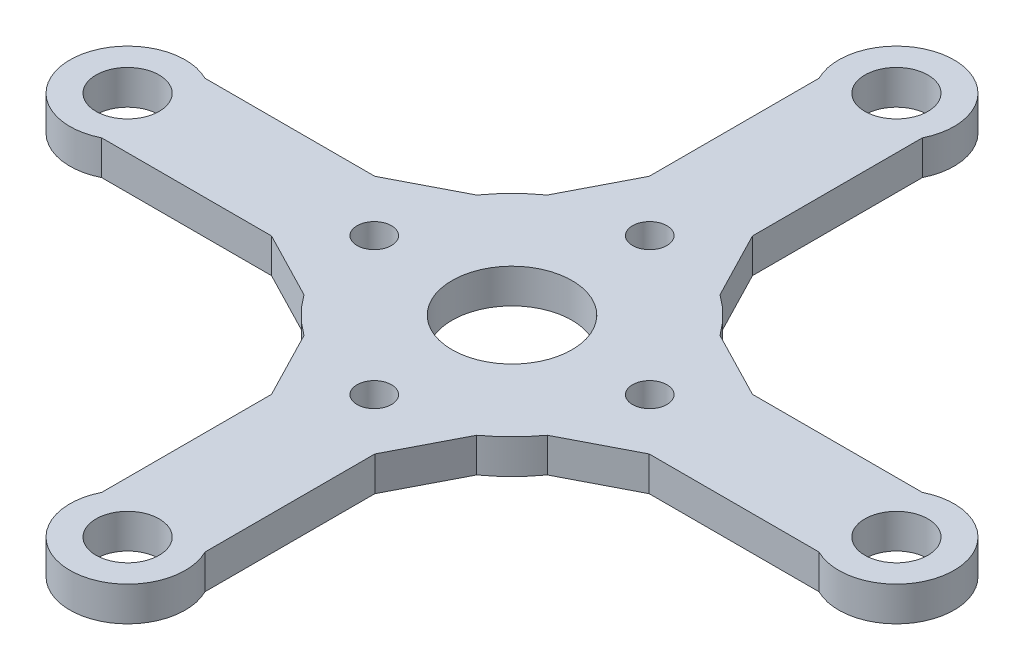
ISO-10303-21;
HEADER;
FILE_DESCRIPTION(('STEP AP214'),'2;1');
FILE_NAME('part.step','',(''),(''),'','','');
FILE_SCHEMA(('AUTOMOTIVE_DESIGN { 1 0 10303 214 1 1 1 1 }'));
ENDSEC;
DATA;
#1=APPLICATION_CONTEXT('core data for automotive mechanical design processes');
#2=APPLICATION_PROTOCOL_DEFINITION('international standard','automotive_design',2000,#1);
#3=PRODUCT_CONTEXT('',#1,'mechanical');
#4=PRODUCT('Part','Part','',(#3));
#5=PRODUCT_RELATED_PRODUCT_CATEGORY('part','',(#4));
#6=PRODUCT_DEFINITION_FORMATION('','',#4);
#7=PRODUCT_DEFINITION_CONTEXT('part definition',#1,'design');
#8=PRODUCT_DEFINITION('design','',#6,#7);
#9=PRODUCT_DEFINITION_SHAPE('','',#8);
#10=(LENGTH_UNIT() NAMED_UNIT(*) SI_UNIT(.MILLI.,.METRE.));
#11=(NAMED_UNIT(*) PLANE_ANGLE_UNIT() SI_UNIT($,.RADIAN.));
#12=(NAMED_UNIT(*) SI_UNIT($,.STERADIAN.) SOLID_ANGLE_UNIT());
#13=UNCERTAINTY_MEASURE_WITH_UNIT(LENGTH_MEASURE(1.E-05),#10,'distance_accuracy_value','');
#14=(GEOMETRIC_REPRESENTATION_CONTEXT(3) GLOBAL_UNCERTAINTY_ASSIGNED_CONTEXT((#13)) GLOBAL_UNIT_ASSIGNED_CONTEXT((#10,
#11,#12)) REPRESENTATION_CONTEXT('',''));
#15=CARTESIAN_POINT('',(0.,0.,0.));
#16=DIRECTION('',(0.,0.,1.));
#17=DIRECTION('',(1.,0.,0.));
#18=AXIS2_PLACEMENT_3D('',#15,#16,#17);
#19=CARTESIAN_POINT('',(-33.4949243756649,3.,4.09499580809621E-11));
#20=DIRECTION('',(0.,1.,0.));
#21=DIRECTION('',(0.,0.,1.));
#22=AXIS2_PLACEMENT_3D('',#19,#20,#21);
#23=PLANE('',#22);
#24=CARTESIAN_POINT('',(-1.03178333980677E-07,3.,-12.));
#25=DIRECTION('',(0.,1.,0.));
#26=DIRECTION('',(0.,0.,1.));
#27=AXIS2_PLACEMENT_3D('',#24,#25,#26);
#28=CIRCLE('',#27,1.5);
#29=CARTESIAN_POINT('',(-1.03178333980677E-07,3.,-10.5));
#30=VERTEX_POINT('',#29);
#31=EDGE_CURVE('E866',#30,#30,#28,.T.);
#32=ORIENTED_EDGE('',*,*,#31,.F.);
#33=EDGE_LOOP('',(#32));
#34=FACE_BOUND('',#33,.T.);
#35=CARTESIAN_POINT('',(12.,3.,-1.03178292082901E-07));
#36=DIRECTION('',(0.,1.,0.));
#37=DIRECTION('',(0.,0.,1.));
#38=AXIS2_PLACEMENT_3D('',#35,#36,#37);
#39=CIRCLE('',#38,1.5);
#40=CARTESIAN_POINT('',(12.,3.,1.49999989682171));
#41=VERTEX_POINT('',#40);
#42=EDGE_CURVE('E867',#41,#41,#39,.T.);
#43=ORIENTED_EDGE('',*,*,#42,.F.);
#44=EDGE_LOOP('',(#43));
#45=FACE_BOUND('',#44,.T.);
#46=CARTESIAN_POINT('',(1.03178250185125E-07,3.,12.));
#47=DIRECTION('',(0.,1.,0.));
#48=DIRECTION('',(0.,0.,1.));
#49=AXIS2_PLACEMENT_3D('',#46,#47,#48);
#50=CIRCLE('',#49,1.5);
#51=CARTESIAN_POINT('',(1.03178250185125E-07,3.,13.5));
#52=VERTEX_POINT('',#51);
#53=EDGE_CURVE('E871',#52,#52,#50,.T.);
#54=ORIENTED_EDGE('',*,*,#53,.F.);
#55=EDGE_LOOP('',(#54));
#56=FACE_BOUND('',#55,.T.);
#57=CARTESIAN_POINT('',(-12.,3.,1.03178208287349E-07));
#58=DIRECTION('',(0.,1.,0.));
#59=DIRECTION('',(0.,0.,1.));
#60=AXIS2_PLACEMENT_3D('',#57,#58,#59);
#61=CIRCLE('',#60,1.5);
#62=CARTESIAN_POINT('',(-12.,3.,1.50000010317821));
#63=VERTEX_POINT('',#62);
#64=EDGE_CURVE('E874',#63,#63,#61,.T.);
#65=ORIENTED_EDGE('',*,*,#64,.F.);
#66=EDGE_LOOP('',(#65));
#67=FACE_BOUND('',#66,.T.);
#68=CARTESIAN_POINT('',(0.,3.,0.));
#69=DIRECTION('',(0.,1.,0.));
#70=DIRECTION('',(0.,0.,1.));
#71=AXIS2_PLACEMENT_3D('',#68,#69,#70);
#72=CIRCLE('',#71,5.22630129733958);
#73=CARTESIAN_POINT('',(0.,3.,5.22630129733958));
#74=VERTEX_POINT('',#73);
#75=EDGE_CURVE('E303',#74,#74,#72,.T.);
#76=ORIENTED_EDGE('',*,*,#75,.F.);
#77=EDGE_LOOP('',(#76));
#78=FACE_BOUND('',#77,.T.);
#79=CARTESIAN_POINT('',(-4.09438051631735E-11,3.,-33.4949243756649));
#80=DIRECTION('',(0.,1.,0.));
#81=DIRECTION('',(0.,0.,1.));
#82=AXIS2_PLACEMENT_3D('',#79,#80,#81);
#83=CIRCLE('',#82,2.75);
#84=CARTESIAN_POINT('',(-4.09438051631735E-11,3.,-30.7449243756649));
#85=VERTEX_POINT('',#84);
#86=EDGE_CURVE('E326',#85,#85,#83,.T.);
#87=ORIENTED_EDGE('',*,*,#86,.F.);
#88=EDGE_LOOP('',(#87));
#89=FACE_BOUND('',#88,.T.);
#90=CARTESIAN_POINT('',(4.09561109987507E-11,3.,33.4949243756649));
#91=DIRECTION('',(0.,1.,0.));
#92=DIRECTION('',(0.,0.,1.));
#93=AXIS2_PLACEMENT_3D('',#90,#91,#92);
#94=CIRCLE('',#93,2.75);
#95=CARTESIAN_POINT('',(4.09561109987507E-11,3.,36.2449243756649));
#96=VERTEX_POINT('',#95);
#97=EDGE_CURVE('E338',#96,#96,#94,.T.);
#98=ORIENTED_EDGE('',*,*,#97,.F.);
#99=EDGE_LOOP('',(#98));
#100=FACE_BOUND('',#99,.T.);
#101=CARTESIAN_POINT('',(-33.4949243756649,3.,4.09499580809621E-11));
#102=DIRECTION('',(0.,1.,0.));
#103=DIRECTION('',(0.,0.,1.));
#104=AXIS2_PLACEMENT_3D('',#101,#102,#103);
#105=CIRCLE('',#104,5.02814778774127);
#106=CARTESIAN_POINT('',(-31.2516521731374,3.,-4.5000000000407));
#107=VERTEX_POINT('',#106);
#108=CARTESIAN_POINT('',(-31.2516521729731,3.,4.5000000000407));
#109=VERTEX_POINT('',#108);
#110=EDGE_CURVE('E210',#107,#109,#105,.T.);
#111=ORIENTED_EDGE('',*,*,#110,.T.);
#112=DIRECTION('',(1.,0.,0.));
#113=VECTOR('',#112,1.);
#114=CARTESIAN_POINT('',(-31.2516521729731,3.,4.5000000000407));
#115=LINE('',#114,#113);
#116=CARTESIAN_POINT('',(-16.4533616375495,3.,4.5000000000409));
#117=VERTEX_POINT('',#116);
#118=EDGE_CURVE('E201',#109,#117,#115,.T.);
#119=ORIENTED_EDGE('',*,*,#118,.T.);
#120=DIRECTION('',(0.888445801917198,0.,0.458981543262588));
#121=VECTOR('',#120,1.);
#122=CARTESIAN_POINT('',(-10.6022858569971,3.,7.52273451655177));
#123=LINE('',#122,#121);
#124=CARTESIAN_POINT('',(-10.6022858569971,3.,7.52273451655177));
#125=VERTEX_POINT('',#124);
#126=EDGE_CURVE('E11',#117,#125,#123,.T.);
#127=ORIENTED_EDGE('',*,*,#126,.T.);
#128=CARTESIAN_POINT('',(0.,3.,0.));
#129=DIRECTION('',(0.,1.,0.));
#130=DIRECTION('',(0.,0.,1.));
#131=AXIS2_PLACEMENT_3D('',#128,#129,#130);
#132=CIRCLE('',#131,13.);
#133=CARTESIAN_POINT('',(-7.52273451655174,3.,10.6022858569971));
#134=VERTEX_POINT('',#133);
#135=EDGE_CURVE('E209',#125,#134,#132,.T.);
#136=ORIENTED_EDGE('',*,*,#135,.T.);
#137=DIRECTION('',(0.4589815432626,0.,0.888445801917192));
#138=VECTOR('',#137,1.);
#139=CARTESIAN_POINT('',(-4.50000000004078,3.,16.4533616375495));
#140=LINE('',#139,#138);
#141=CARTESIAN_POINT('',(-4.50000000004079,3.,16.4533616375495));
#142=VERTEX_POINT('',#141);
#143=EDGE_CURVE('E296',#134,#142,#140,.T.);
#144=ORIENTED_EDGE('',*,*,#143,.T.);
#145=DIRECTION('',(0.,0.,1.));
#146=VECTOR('',#145,1.);
#147=CARTESIAN_POINT('',(-4.50000000004022,3.,31.2516521731369));
#148=LINE('',#147,#146);
#149=CARTESIAN_POINT('',(-4.5000000000402,3.,31.2516521731369));
#150=VERTEX_POINT('',#149);
#151=EDGE_CURVE('E345',#142,#150,#148,.T.);
#152=ORIENTED_EDGE('',*,*,#151,.T.);
#153=CARTESIAN_POINT('',(4.14568791306697E-11,3.,33.4949243756645));
#154=DIRECTION('',(0.,1.,0.));
#155=DIRECTION('',(0.,0.,1.));
#156=AXIS2_PLACEMENT_3D('',#153,#154,#155);
#157=CIRCLE('',#156,5.0281477877413);
#158=CARTESIAN_POINT('',(4.50000000004146,3.,31.2516521729732));
#159=VERTEX_POINT('',#158);
#160=EDGE_CURVE('E347',#150,#159,#157,.T.);
#161=ORIENTED_EDGE('',*,*,#160,.T.);
#162=DIRECTION('',(0.,0.,-1.));
#163=VECTOR('',#162,1.);
#164=CARTESIAN_POINT('',(4.50000000004146,3.,31.2516521729732));
#165=LINE('',#164,#163);
#166=CARTESIAN_POINT('',(4.50000000004106,3.,16.4533616375495));
#167=VERTEX_POINT('',#166);
#168=EDGE_CURVE('E349',#159,#167,#165,.T.);
#169=ORIENTED_EDGE('',*,*,#168,.T.);
#170=DIRECTION('',(0.458981543262569,0.,-0.888445801917208));
#171=VECTOR('',#170,1.);
#172=CARTESIAN_POINT('',(7.52273451655179,3.,10.6022858569971));
#173=LINE('',#172,#171);
#174=CARTESIAN_POINT('',(7.52273451655179,3.,10.6022858569971));
#175=VERTEX_POINT('',#174);
#176=EDGE_CURVE('E292',#167,#175,#173,.T.);
#177=ORIENTED_EDGE('',*,*,#176,.T.);
#178=CARTESIAN_POINT('',(0.,3.,0.));
#179=DIRECTION('',(0.,1.,0.));
#180=DIRECTION('',(0.,0.,1.));
#181=AXIS2_PLACEMENT_3D('',#178,#179,#180);
#182=CIRCLE('',#181,13.);
#183=CARTESIAN_POINT('',(10.6022858569971,3.,7.52273451655177));
#184=VERTEX_POINT('',#183);
#185=EDGE_CURVE('E352',#175,#184,#182,.T.);
#186=ORIENTED_EDGE('',*,*,#185,.T.);
#187=DIRECTION('',(0.888445801917201,0.,-0.458981543262582));
#188=VECTOR('',#187,1.);
#189=CARTESIAN_POINT('',(16.4533616375495,3.,4.50000000004094));
#190=LINE('',#189,#188);
#191=CARTESIAN_POINT('',(16.4533616375495,3.,4.50000000004094));
#192=VERTEX_POINT('',#191);
#193=EDGE_CURVE('E288',#184,#192,#190,.T.);
#194=ORIENTED_EDGE('',*,*,#193,.T.);
#195=DIRECTION('',(1.,0.,0.));
#196=VECTOR('',#195,1.);
#197=CARTESIAN_POINT('',(31.2516521731373,3.,4.50000000004092));
#198=LINE('',#197,#196);
#199=CARTESIAN_POINT('',(31.2516521731374,3.,4.50000000004085));
#200=VERTEX_POINT('',#199);
#201=EDGE_CURVE('E355',#192,#200,#198,.T.);
#202=ORIENTED_EDGE('',*,*,#201,.T.);
#203=CARTESIAN_POINT('',(33.4949243756649,3.,-4.07160642741549E-11));
#204=DIRECTION('',(0.,1.,0.));
#205=DIRECTION('',(0.,0.,1.));
#206=AXIS2_PLACEMENT_3D('',#203,#204,#205);
#207=CIRCLE('',#206,5.0281477877412);
#208=CARTESIAN_POINT('',(31.2516521729734,3.,-4.50000000004044));
#209=VERTEX_POINT('',#208);
#210=EDGE_CURVE('E357',#200,#209,#207,.T.);
#211=ORIENTED_EDGE('',*,*,#210,.T.);
#212=DIRECTION('',(-1.,0.,0.));
#213=VECTOR('',#212,1.);
#214=CARTESIAN_POINT('',(31.2516521729734,3.,-4.50000000004044));
#215=LINE('',#214,#213);
#216=CARTESIAN_POINT('',(16.4533616375495,3.,-4.50000000004083));
#217=VERTEX_POINT('',#216);
#218=EDGE_CURVE('E359',#209,#217,#215,.T.);
#219=ORIENTED_EDGE('',*,*,#218,.T.);
#220=DIRECTION('',(-0.888445801917195,0.,-0.458981543262594));
#221=VECTOR('',#220,1.);
#222=CARTESIAN_POINT('',(10.6022858569971,3.,-7.52273451655176));
#223=LINE('',#222,#221);
#224=CARTESIAN_POINT('',(10.6022858569971,3.,-7.52273451655175));
#225=VERTEX_POINT('',#224);
#226=EDGE_CURVE('E284',#217,#225,#223,.T.);
#227=ORIENTED_EDGE('',*,*,#226,.T.);
#228=CARTESIAN_POINT('',(0.,3.,0.));
#229=DIRECTION('',(0.,1.,0.));
#230=DIRECTION('',(0.,0.,1.));
#231=AXIS2_PLACEMENT_3D('',#228,#229,#230);
#232=CIRCLE('',#231,13.);
#233=CARTESIAN_POINT('',(7.52273451655177,3.,-10.6022858569971));
#234=VERTEX_POINT('',#233);
#235=EDGE_CURVE('E362',#225,#234,#232,.T.);
#236=ORIENTED_EDGE('',*,*,#235,.T.);
#237=DIRECTION('',(-0.458981543262585,0.,-0.8884458019172));
#238=VECTOR('',#237,1.);
#239=CARTESIAN_POINT('',(4.50000000004092,3.,-16.4533616375495));
#240=LINE('',#239,#238);
#241=CARTESIAN_POINT('',(4.50000000004092,3.,-16.4533616375495));
#242=VERTEX_POINT('',#241);
#243=EDGE_CURVE('E280',#234,#242,#240,.T.);
#244=ORIENTED_EDGE('',*,*,#243,.T.);
#245=DIRECTION('',(0.,0.,-1.));
#246=VECTOR('',#245,1.);
#247=CARTESIAN_POINT('',(4.50000000004081,3.,-31.2516521731374));
#248=LINE('',#247,#246);
#249=CARTESIAN_POINT('',(4.50000000004081,3.,-31.2516521731374));
#250=VERTEX_POINT('',#249);
#251=EDGE_CURVE('E365',#242,#250,#248,.T.);
#252=ORIENTED_EDGE('',*,*,#251,.T.);
#253=CARTESIAN_POINT('',(-4.08364806245104E-11,3.,-33.4949243756649));
#254=DIRECTION('',(0.,1.,0.));
#255=DIRECTION('',(0.,0.,1.));
#256=AXIS2_PLACEMENT_3D('',#253,#254,#255);
#257=CIRCLE('',#256,5.02814778774127);
#258=CARTESIAN_POINT('',(-4.50000000004059,3.,-31.2516521729731));
#259=VERTEX_POINT('',#258);
#260=EDGE_CURVE('E367',#250,#259,#257,.T.);
#261=ORIENTED_EDGE('',*,*,#260,.T.);
#262=DIRECTION('',(0.,0.,1.));
#263=VECTOR('',#262,1.);
#264=CARTESIAN_POINT('',(-4.50000000004059,3.,-31.2516521729731));
#265=LINE('',#264,#263);
#266=CARTESIAN_POINT('',(-4.50000000004087,3.,-16.4533616375495));
#267=VERTEX_POINT('',#266);
#268=EDGE_CURVE('E369',#259,#267,#265,.T.);
#269=ORIENTED_EDGE('',*,*,#268,.T.);
#270=DIRECTION('',(-0.458981543262591,0.,0.888445801917197));
#271=VECTOR('',#270,1.);
#272=CARTESIAN_POINT('',(-7.52273451655176,3.,-10.6022858569971));
#273=LINE('',#272,#271);
#274=CARTESIAN_POINT('',(-7.52273451655176,3.,-10.6022858569971));
#275=VERTEX_POINT('',#274);
#276=EDGE_CURVE('E276',#267,#275,#273,.T.);
#277=ORIENTED_EDGE('',*,*,#276,.T.);
#278=CARTESIAN_POINT('',(0.,3.,0.));
#279=DIRECTION('',(0.,1.,0.));
#280=DIRECTION('',(0.,0.,1.));
#281=AXIS2_PLACEMENT_3D('',#278,#279,#280);
#282=CIRCLE('',#281,13.);
#283=CARTESIAN_POINT('',(-10.6022858569971,3.,-7.52273451655176));
#284=VERTEX_POINT('',#283);
#285=EDGE_CURVE('E372',#275,#284,#282,.T.);
#286=ORIENTED_EDGE('',*,*,#285,.T.);
#287=DIRECTION('',(-0.888445801917198,0.,0.458981543262588));
#288=VECTOR('',#287,1.);
#289=CARTESIAN_POINT('',(-16.4533616375495,3.,-4.50000000004089));
#290=LINE('',#289,#288);
#291=CARTESIAN_POINT('',(-16.4533616375495,3.,-4.50000000004089));
#292=VERTEX_POINT('',#291);
#293=EDGE_CURVE('E272',#284,#292,#290,.T.);
#294=ORIENTED_EDGE('',*,*,#293,.T.);
#295=DIRECTION('',(-1.,0.,0.));
#296=VECTOR('',#295,1.);
#297=CARTESIAN_POINT('',(-31.2516521731374,3.,-4.5000000000407));
#298=LINE('',#297,#296);
#299=EDGE_CURVE('E215',#292,#107,#298,.T.);
#300=ORIENTED_EDGE('',*,*,#299,.T.);
#301=EDGE_LOOP('',(#111,#119,#127,#136,#144,#152,#161,#169,#177,#186,#194,#202,#211,#219,#227,
#236,#244,#252,#261,#269,#277,#286,#294,#300));
#302=FACE_BOUND('',#301,.T.);
#303=CARTESIAN_POINT('',(-33.4949243756649,3.,4.09499580809621E-11));
#304=DIRECTION('',(0.,1.,0.));
#305=DIRECTION('',(0.,0.,1.));
#306=AXIS2_PLACEMENT_3D('',#303,#304,#305);
#307=CIRCLE('',#306,2.75);
#308=CARTESIAN_POINT('',(-33.4949243756649,3.,2.75000000004095));
#309=VERTEX_POINT('',#308);
#310=EDGE_CURVE('E332',#309,#309,#307,.T.);
#311=ORIENTED_EDGE('',*,*,#310,.F.);
#312=EDGE_LOOP('',(#311));
#313=FACE_BOUND('',#312,.T.);
#314=CARTESIAN_POINT('',(33.4949243756649,3.,-4.09458561357696E-11));
#315=DIRECTION('',(0.,1.,0.));
#316=DIRECTION('',(0.,0.,1.));
#317=AXIS2_PLACEMENT_3D('',#314,#315,#316);
#318=CIRCLE('',#317,2.75);
#319=CARTESIAN_POINT('',(33.4949243756649,3.,2.74999999995906));
#320=VERTEX_POINT('',#319);
#321=EDGE_CURVE('E317',#320,#320,#318,.T.);
#322=ORIENTED_EDGE('',*,*,#321,.F.);
#323=EDGE_LOOP('',(#322));
#324=FACE_BOUND('',#323,.T.);
#325=ADVANCED_FACE('F41',(#34,#45,#56,#67,#78,#89,#100,#302,#313,#324),#23,.T.);
#326=CARTESIAN_POINT('',(-33.4949243756649,0.,4.09499580809621E-11));
#327=DIRECTION('',(0.,1.,0.));
#328=DIRECTION('',(0.,0.,1.));
#329=AXIS2_PLACEMENT_3D('',#326,#327,#328);
#330=PLANE('',#329);
#331=CARTESIAN_POINT('',(-1.03178333980677E-07,0.,-12.));
#332=DIRECTION('',(0.,1.,0.));
#333=DIRECTION('',(0.,0.,1.));
#334=AXIS2_PLACEMENT_3D('',#331,#332,#333);
#335=CIRCLE('',#334,1.5);
#336=CARTESIAN_POINT('',(-1.03178333980677E-07,0.,-10.5));
#337=VERTEX_POINT('',#336);
#338=EDGE_CURVE('E46',#337,#337,#335,.T.);
#339=ORIENTED_EDGE('',*,*,#338,.T.);
#340=EDGE_LOOP('',(#339));
#341=FACE_BOUND('',#340,.T.);
#342=CARTESIAN_POINT('',(12.,0.,-1.03178292082901E-07));
#343=DIRECTION('',(0.,1.,0.));
#344=DIRECTION('',(0.,0.,1.));
#345=AXIS2_PLACEMENT_3D('',#342,#343,#344);
#346=CIRCLE('',#345,1.5);
#347=CARTESIAN_POINT('',(12.,0.,1.49999989682171));
#348=VERTEX_POINT('',#347);
#349=EDGE_CURVE('E308',#348,#348,#346,.T.);
#350=ORIENTED_EDGE('',*,*,#349,.T.);
#351=EDGE_LOOP('',(#350));
#352=FACE_BOUND('',#351,.T.);
#353=CARTESIAN_POINT('',(1.03178250185125E-07,0.,12.));
#354=DIRECTION('',(0.,1.,0.));
#355=DIRECTION('',(0.,0.,1.));
#356=AXIS2_PLACEMENT_3D('',#353,#354,#355);
#357=CIRCLE('',#356,1.5);
#358=CARTESIAN_POINT('',(1.03178250185125E-07,0.,13.5));
#359=VERTEX_POINT('',#358);
#360=EDGE_CURVE('E306',#359,#359,#357,.T.);
#361=ORIENTED_EDGE('',*,*,#360,.T.);
#362=EDGE_LOOP('',(#361));
#363=FACE_BOUND('',#362,.T.);
#364=CARTESIAN_POINT('',(-12.,0.,1.03178208287349E-07));
#365=DIRECTION('',(0.,1.,0.));
#366=DIRECTION('',(0.,0.,1.));
#367=AXIS2_PLACEMENT_3D('',#364,#365,#366);
#368=CIRCLE('',#367,1.5);
#369=CARTESIAN_POINT('',(-12.,0.,1.50000010317821));
#370=VERTEX_POINT('',#369);
#371=EDGE_CURVE('E302',#370,#370,#368,.T.);
#372=ORIENTED_EDGE('',*,*,#371,.T.);
#373=EDGE_LOOP('',(#372));
#374=FACE_BOUND('',#373,.T.);
#375=CARTESIAN_POINT('',(0.,0.,0.));
#376=DIRECTION('',(0.,1.,0.));
#377=DIRECTION('',(0.,0.,1.));
#378=AXIS2_PLACEMENT_3D('',#375,#376,#377);
#379=CIRCLE('',#378,5.22630129733958);
#380=CARTESIAN_POINT('',(0.,0.,5.22630129733958));
#381=VERTEX_POINT('',#380);
#382=EDGE_CURVE('E299',#381,#381,#379,.T.);
#383=ORIENTED_EDGE('',*,*,#382,.T.);
#384=EDGE_LOOP('',(#383));
#385=FACE_BOUND('',#384,.T.);
#386=CARTESIAN_POINT('',(-33.4949243756649,0.,4.09499580809621E-11));
#387=DIRECTION('',(0.,1.,0.));
#388=DIRECTION('',(0.,0.,1.));
#389=AXIS2_PLACEMENT_3D('',#386,#387,#388);
#390=CIRCLE('',#389,5.02814778774127);
#391=CARTESIAN_POINT('',(-31.2516521731374,0.,-4.5000000000407));
#392=VERTEX_POINT('',#391);
#393=CARTESIAN_POINT('',(-31.2516521729731,0.,4.5000000000407));
#394=VERTEX_POINT('',#393);
#395=EDGE_CURVE('E223',#392,#394,#390,.T.);
#396=ORIENTED_EDGE('',*,*,#395,.F.);
#397=DIRECTION('',(-1.,0.,0.));
#398=VECTOR('',#397,1.);
#399=CARTESIAN_POINT('',(-31.2516521731374,0.,-4.5000000000407));
#400=LINE('',#399,#398);
#401=CARTESIAN_POINT('',(-16.4533616375495,0.,-4.50000000004089));
#402=VERTEX_POINT('',#401);
#403=EDGE_CURVE('E219',#402,#392,#400,.T.);
#404=ORIENTED_EDGE('',*,*,#403,.F.);
#405=DIRECTION('',(0.888445801917198,0.,-0.458981543262588));
#406=VECTOR('',#405,1.);
#407=CARTESIAN_POINT('',(-31.7398906444286,0.,3.3972005490136));
#408=LINE('',#407,#406);
#409=CARTESIAN_POINT('',(-10.6022858569971,0.,-7.52273451655176));
#410=VERTEX_POINT('',#409);
#411=EDGE_CURVE('E270',#402,#410,#408,.T.);
#412=ORIENTED_EDGE('',*,*,#411,.T.);
#413=CARTESIAN_POINT('',(0.,0.,0.));
#414=DIRECTION('',(0.,1.,0.));
#415=DIRECTION('',(0.,0.,1.));
#416=AXIS2_PLACEMENT_3D('',#413,#414,#415);
#417=CIRCLE('',#416,13.);
#418=CARTESIAN_POINT('',(-7.52273451655176,0.,-10.6022858569971));
#419=VERTEX_POINT('',#418);
#420=EDGE_CURVE('E410',#419,#410,#417,.T.);
#421=ORIENTED_EDGE('',*,*,#420,.F.);
#422=DIRECTION('',(0.458981543262591,0.,-0.888445801917197));
#423=VECTOR('',#422,1.);
#424=CARTESIAN_POINT('',(-17.3175439180443,0.,8.35742487881457));
#425=LINE('',#424,#423);
#426=CARTESIAN_POINT('',(-4.50000000004087,0.,-16.4533616375495));
#427=VERTEX_POINT('',#426);
#428=EDGE_CURVE('E274',#419,#427,#425,.T.);
#429=ORIENTED_EDGE('',*,*,#428,.T.);
#430=DIRECTION('',(0.,0.,1.));
#431=VECTOR('',#430,1.);
#432=CARTESIAN_POINT('',(-4.50000000004059,0.,-31.2516521729731));
#433=LINE('',#432,#431);
#434=CARTESIAN_POINT('',(-4.50000000004059,0.,-31.2516521729731));
#435=VERTEX_POINT('',#434);
#436=EDGE_CURVE('E407',#435,#427,#433,.T.);
#437=ORIENTED_EDGE('',*,*,#436,.F.);
#438=CARTESIAN_POINT('',(-4.08364806245104E-11,0.,-33.4949243756649));
#439=DIRECTION('',(0.,1.,0.));
#440=DIRECTION('',(0.,0.,1.));
#441=AXIS2_PLACEMENT_3D('',#438,#439,#440);
#442=CIRCLE('',#441,5.02814778774127);
#443=CARTESIAN_POINT('',(4.50000000004081,0.,-31.2516521731374));
#444=VERTEX_POINT('',#443);
#445=EDGE_CURVE('E405',#444,#435,#442,.T.);
#446=ORIENTED_EDGE('',*,*,#445,.F.);
#447=DIRECTION('',(0.,0.,-1.));
#448=VECTOR('',#447,1.);
#449=CARTESIAN_POINT('',(4.50000000004081,0.,-31.2516521731374));
#450=LINE('',#449,#448);
#451=CARTESIAN_POINT('',(4.50000000004092,0.,-16.4533616375495));
#452=VERTEX_POINT('',#451);
#453=EDGE_CURVE('E403',#452,#444,#450,.T.);
#454=ORIENTED_EDGE('',*,*,#453,.F.);
#455=DIRECTION('',(0.458981543262585,0.,0.8884458019172));
#456=VECTOR('',#455,1.);
#457=CARTESIAN_POINT('',(3.20519059854102,0.,-18.9597107357471));
#458=LINE('',#457,#456);
#459=CARTESIAN_POINT('',(7.52273451655177,0.,-10.6022858569971));
#460=VERTEX_POINT('',#459);
#461=EDGE_CURVE('E278',#452,#460,#458,.T.);
#462=ORIENTED_EDGE('',*,*,#461,.T.);
#463=CARTESIAN_POINT('',(0.,0.,0.));
#464=DIRECTION('',(0.,1.,0.));
#465=DIRECTION('',(0.,0.,1.));
#466=AXIS2_PLACEMENT_3D('',#463,#464,#465);
#467=CIRCLE('',#466,13.);
#468=CARTESIAN_POINT('',(10.6022858569971,0.,-7.52273451655175));
#469=VERTEX_POINT('',#468);
#470=EDGE_CURVE('E400',#469,#460,#467,.T.);
#471=ORIENTED_EDGE('',*,*,#470,.F.);
#472=DIRECTION('',(0.888445801917195,0.,0.458981543262594));
#473=VECTOR('',#472,1.);
#474=CARTESIAN_POINT('',(-21.1376047873976,0.,-23.9199350655482));
#475=LINE('',#474,#473);
#476=CARTESIAN_POINT('',(16.4533616375495,0.,-4.50000000004083));
#477=VERTEX_POINT('',#476);
#478=EDGE_CURVE('E282',#469,#477,#475,.T.);
#479=ORIENTED_EDGE('',*,*,#478,.T.);
#480=DIRECTION('',(-1.,0.,0.));
#481=VECTOR('',#480,1.);
#482=CARTESIAN_POINT('',(31.2516521729734,0.,-4.50000000004044));
#483=LINE('',#482,#481);
#484=CARTESIAN_POINT('',(31.2516521729734,0.,-4.50000000004044));
#485=VERTEX_POINT('',#484);
#486=EDGE_CURVE('E397',#485,#477,#483,.T.);
#487=ORIENTED_EDGE('',*,*,#486,.F.);
#488=CARTESIAN_POINT('',(33.4949243756649,0.,-4.07160642741549E-11));
#489=DIRECTION('',(0.,1.,0.));
#490=DIRECTION('',(0.,0.,1.));
#491=AXIS2_PLACEMENT_3D('',#488,#489,#490);
#492=CIRCLE('',#491,5.0281477877412);
#493=CARTESIAN_POINT('',(31.2516521731374,0.,4.50000000004085));
#494=VERTEX_POINT('',#493);
#495=EDGE_CURVE('E395',#494,#485,#492,.T.);
#496=ORIENTED_EDGE('',*,*,#495,.F.);
#497=DIRECTION('',(1.,0.,0.));
#498=VECTOR('',#497,1.);
#499=CARTESIAN_POINT('',(31.2516521731373,0.,4.50000000004092));
#500=LINE('',#499,#498);
#501=CARTESIAN_POINT('',(16.4533616375495,0.,4.50000000004094));
#502=VERTEX_POINT('',#501);
#503=EDGE_CURVE('E393',#502,#494,#500,.T.);
#504=ORIENTED_EDGE('',*,*,#503,.F.);
#505=DIRECTION('',(-0.888445801917201,0.,0.458981543262582));
#506=VECTOR('',#505,1.);
#507=CARTESIAN_POINT('',(-21.1376047874315,0.,23.9199350655653));
#508=LINE('',#507,#506);
#509=CARTESIAN_POINT('',(10.6022858569971,0.,7.52273451655177));
#510=VERTEX_POINT('',#509);
#511=EDGE_CURVE('E286',#502,#510,#508,.T.);
#512=ORIENTED_EDGE('',*,*,#511,.T.);
#513=CARTESIAN_POINT('',(0.,0.,0.));
#514=DIRECTION('',(0.,1.,0.));
#515=DIRECTION('',(0.,0.,1.));
#516=AXIS2_PLACEMENT_3D('',#513,#514,#515);
#517=CIRCLE('',#516,13.);
#518=CARTESIAN_POINT('',(7.52273451655179,0.,10.6022858569971));
#519=VERTEX_POINT('',#518);
#520=EDGE_CURVE('E390',#519,#510,#517,.T.);
#521=ORIENTED_EDGE('',*,*,#520,.F.);
#522=DIRECTION('',(-0.458981543262569,0.,0.888445801917208));
#523=VECTOR('',#522,1.);
#524=CARTESIAN_POINT('',(3.20519059850814,0.,18.9597107358111));
#525=LINE('',#524,#523);
#526=CARTESIAN_POINT('',(4.50000000004106,0.,16.4533616375495));
#527=VERTEX_POINT('',#526);
#528=EDGE_CURVE('E290',#519,#527,#525,.T.);
#529=ORIENTED_EDGE('',*,*,#528,.T.);
#530=DIRECTION('',(0.,0.,-1.));
#531=VECTOR('',#530,1.);
#532=CARTESIAN_POINT('',(4.50000000004146,0.,31.2516521729732));
#533=LINE('',#532,#531);
#534=CARTESIAN_POINT('',(4.50000000004146,0.,31.2516521729732));
#535=VERTEX_POINT('',#534);
#536=EDGE_CURVE('E387',#535,#527,#533,.T.);
#537=ORIENTED_EDGE('',*,*,#536,.F.);
#538=CARTESIAN_POINT('',(4.14568791306697E-11,0.,33.4949243756645));
#539=DIRECTION('',(0.,1.,0.));
#540=DIRECTION('',(0.,0.,1.));
#541=AXIS2_PLACEMENT_3D('',#538,#539,#540);
#542=CIRCLE('',#541,5.0281477877413);
#543=CARTESIAN_POINT('',(-4.5000000000402,0.,31.2516521731369));
#544=VERTEX_POINT('',#543);
#545=EDGE_CURVE('E385',#544,#535,#542,.T.);
#546=ORIENTED_EDGE('',*,*,#545,.F.);
#547=DIRECTION('',(0.,0.,1.));
#548=VECTOR('',#547,1.);
#549=CARTESIAN_POINT('',(-4.50000000004022,0.,31.2516521731369));
#550=LINE('',#549,#548);
#551=CARTESIAN_POINT('',(-4.50000000004079,0.,16.4533616375495));
#552=VERTEX_POINT('',#551);
#553=EDGE_CURVE('E383',#552,#544,#550,.T.);
#554=ORIENTED_EDGE('',*,*,#553,.F.);
#555=DIRECTION('',(-0.4589815432626,0.,-0.888445801917192));
#556=VECTOR('',#555,1.);
#557=CARTESIAN_POINT('',(-17.3175439180112,0.,-8.35742487874999));
#558=LINE('',#557,#556);
#559=CARTESIAN_POINT('',(-7.52273451655174,0.,10.6022858569971));
#560=VERTEX_POINT('',#559);
#561=EDGE_CURVE('E294',#552,#560,#558,.T.);
#562=ORIENTED_EDGE('',*,*,#561,.T.);
#563=CARTESIAN_POINT('',(0.,0.,0.));
#564=DIRECTION('',(0.,1.,0.));
#565=DIRECTION('',(0.,0.,1.));
#566=AXIS2_PLACEMENT_3D('',#563,#564,#565);
#567=CIRCLE('',#566,13.);
#568=CARTESIAN_POINT('',(-10.6022858569971,0.,7.52273451655177));
#569=VERTEX_POINT('',#568);
#570=EDGE_CURVE('E380',#569,#560,#567,.T.);
#571=ORIENTED_EDGE('',*,*,#570,.F.);
#572=DIRECTION('',(-0.888445801917198,0.,-0.458981543262588));
#573=VECTOR('',#572,1.);
#574=CARTESIAN_POINT('',(-31.7398906443952,0.,-3.39720054899635));
#575=LINE('',#574,#573);
#576=CARTESIAN_POINT('',(-16.4533616375495,0.,4.5000000000409));
#577=VERTEX_POINT('',#576);
#578=EDGE_CURVE('E51',#569,#577,#575,.T.);
#579=ORIENTED_EDGE('',*,*,#578,.T.);
#580=DIRECTION('',(1.,0.,0.));
#581=VECTOR('',#580,1.);
#582=CARTESIAN_POINT('',(-31.2516521729731,0.,4.5000000000407));
#583=LINE('',#582,#581);
#584=EDGE_CURVE('E378',#394,#577,#583,.T.);
#585=ORIENTED_EDGE('',*,*,#584,.F.);
#586=EDGE_LOOP('',(#396,#404,#412,#421,#429,#437,#446,#454,#462,#471,#479,#487,#496,#504,#512,
#521,#529,#537,#546,#554,#562,#571,#579,#585));
#587=FACE_BOUND('',#586,.T.);
#588=CARTESIAN_POINT('',(4.09561109987507E-11,0.,33.4949243756649));
#589=DIRECTION('',(0.,1.,0.));
#590=DIRECTION('',(0.,0.,1.));
#591=AXIS2_PLACEMENT_3D('',#588,#589,#590);
#592=CIRCLE('',#591,2.75);
#593=CARTESIAN_POINT('',(4.09561109987507E-11,0.,36.2449243756649));
#594=VERTEX_POINT('',#593);
#595=EDGE_CURVE('E335',#594,#594,#592,.T.);
#596=ORIENTED_EDGE('',*,*,#595,.T.);
#597=EDGE_LOOP('',(#596));
#598=FACE_BOUND('',#597,.T.);
#599=CARTESIAN_POINT('',(-33.4949243756649,0.,4.09499580809621E-11));
#600=DIRECTION('',(0.,1.,0.));
#601=DIRECTION('',(0.,0.,1.));
#602=AXIS2_PLACEMENT_3D('',#599,#600,#601);
#603=CIRCLE('',#602,2.75);
#604=CARTESIAN_POINT('',(-33.4949243756649,0.,2.75000000004095));
#605=VERTEX_POINT('',#604);
#606=EDGE_CURVE('E329',#605,#605,#603,.T.);
#607=ORIENTED_EDGE('',*,*,#606,.T.);
#608=EDGE_LOOP('',(#607));
#609=FACE_BOUND('',#608,.T.);
#610=CARTESIAN_POINT('',(-4.09438051631735E-11,0.,-33.4949243756649));
#611=DIRECTION('',(0.,1.,0.));
#612=DIRECTION('',(0.,0.,1.));
#613=AXIS2_PLACEMENT_3D('',#610,#611,#612);
#614=CIRCLE('',#613,2.75);
#615=CARTESIAN_POINT('',(-4.09438051631735E-11,0.,-30.7449243756649));
#616=VERTEX_POINT('',#615);
#617=EDGE_CURVE('E322',#616,#616,#614,.T.);
#618=ORIENTED_EDGE('',*,*,#617,.T.);
#619=EDGE_LOOP('',(#618));
#620=FACE_BOUND('',#619,.T.);
#621=CARTESIAN_POINT('',(33.4949243756649,0.,-4.09458561357696E-11));
#622=DIRECTION('',(0.,1.,0.));
#623=DIRECTION('',(0.,0.,1.));
#624=AXIS2_PLACEMENT_3D('',#621,#622,#623);
#625=CIRCLE('',#624,2.75);
#626=CARTESIAN_POINT('',(33.4949243756649,0.,2.74999999995906));
#627=VERTEX_POINT('',#626);
#628=EDGE_CURVE('E313',#627,#627,#625,.T.);
#629=ORIENTED_EDGE('',*,*,#628,.T.);
#630=EDGE_LOOP('',(#629));
#631=FACE_BOUND('',#630,.T.);
#632=ADVANCED_FACE('F436',(#341,#352,#363,#374,#385,#587,#598,#609,#620,#631),#330,.F.);
#633=CARTESIAN_POINT('',(-33.4949243756649,3.,4.09499580809621E-11));
#634=DIRECTION('',(0.,-1.,0.));
#635=DIRECTION('',(0.,0.,-1.));
#636=AXIS2_PLACEMENT_3D('',#633,#634,#635);
#637=CYLINDRICAL_SURFACE('',#636,5.02814778774127);
#638=ORIENTED_EDGE('',*,*,#395,.T.);
#639=DIRECTION('',(0.,-1.,0.));
#640=VECTOR('',#639,1.);
#641=CARTESIAN_POINT('',(-31.2516521729731,3.,4.5000000000407));
#642=LINE('',#641,#640);
#643=EDGE_CURVE('E205',#109,#394,#642,.T.);
#644=ORIENTED_EDGE('',*,*,#643,.F.);
#645=ORIENTED_EDGE('',*,*,#110,.F.);
#646=DIRECTION('',(0.,-1.,0.));
#647=VECTOR('',#646,1.);
#648=CARTESIAN_POINT('',(-31.2516521731374,3.,-4.5000000000407));
#649=LINE('',#648,#647);
#650=EDGE_CURVE('E376',#107,#392,#649,.T.);
#651=ORIENTED_EDGE('',*,*,#650,.T.);
#652=EDGE_LOOP('',(#638,#644,#645,#651));
#653=FACE_BOUND('',#652,.T.);
#654=ADVANCED_FACE('F221',(#653),#637,.T.);
#655=CARTESIAN_POINT('',(-31.2516521729731,3.,4.5000000000407));
#656=DIRECTION('',(0.,0.,-1.));
#657=DIRECTION('',(-1.,0.,0.));
#658=AXIS2_PLACEMENT_3D('',#655,#656,#657);
#659=PLANE('',#658);
#660=ORIENTED_EDGE('',*,*,#584,.T.);
#661=DIRECTION('',(0.,1.,0.));
#662=VECTOR('',#661,1.);
#663=CARTESIAN_POINT('',(-16.4533616375495,3.,4.5000000000409));
#664=LINE('',#663,#662);
#665=EDGE_CURVE('E59',#577,#117,#664,.T.);
#666=ORIENTED_EDGE('',*,*,#665,.T.);
#667=ORIENTED_EDGE('',*,*,#118,.F.);
#668=ORIENTED_EDGE('',*,*,#643,.T.);
#669=EDGE_LOOP('',(#660,#666,#667,#668));
#670=FACE_BOUND('',#669,.T.);
#671=ADVANCED_FACE('F203',(#670),#659,.F.);
#672=CARTESIAN_POINT('',(0.,3.,0.));
#673=DIRECTION('',(0.,-1.,0.));
#674=DIRECTION('',(0.,0.,-1.));
#675=AXIS2_PLACEMENT_3D('',#672,#673,#674);
#676=CYLINDRICAL_SURFACE('',#675,13.);
#677=ORIENTED_EDGE('',*,*,#570,.T.);
#678=DIRECTION('',(0.,-1.,0.));
#679=VECTOR('',#678,1.);
#680=CARTESIAN_POINT('',(-7.52273451655174,3.,10.6022858569971));
#681=LINE('',#680,#679);
#682=EDGE_CURVE('E267',#560,#134,#681,.F.);
#683=ORIENTED_EDGE('',*,*,#682,.T.);
#684=ORIENTED_EDGE('',*,*,#135,.F.);
#685=DIRECTION('',(0.,-1.,0.));
#686=VECTOR('',#685,1.);
#687=CARTESIAN_POINT('',(-10.6022858569971,3.,7.52273451655177));
#688=LINE('',#687,#686);
#689=EDGE_CURVE('E264',#125,#569,#688,.T.);
#690=ORIENTED_EDGE('',*,*,#689,.T.);
#691=EDGE_LOOP('',(#677,#683,#684,#690));
#692=FACE_BOUND('',#691,.T.);
#693=ADVANCED_FACE('F516',(#692),#676,.T.);
#694=CARTESIAN_POINT('',(-4.50000000004022,3.,31.2516521731369));
#695=DIRECTION('',(1.,0.,0.));
#696=DIRECTION('',(0.,0.,-1.));
#697=AXIS2_PLACEMENT_3D('',#694,#695,#696);
#698=PLANE('',#697);
#699=ORIENTED_EDGE('',*,*,#151,.F.);
#700=DIRECTION('',(0.,-1.,0.));
#701=VECTOR('',#700,1.);
#702=CARTESIAN_POINT('',(-4.50000000004079,0.,16.4533616375495));
#703=LINE('',#702,#701);
#704=EDGE_CURVE('E261',#142,#552,#703,.T.);
#705=ORIENTED_EDGE('',*,*,#704,.T.);
#706=ORIENTED_EDGE('',*,*,#553,.T.);
#707=DIRECTION('',(0.,-1.,0.));
#708=VECTOR('',#707,1.);
#709=CARTESIAN_POINT('',(-4.5000000000402,3.,31.2516521731369));
#710=LINE('',#709,#708);
#711=EDGE_CURVE('E225',#150,#544,#710,.T.);
#712=ORIENTED_EDGE('',*,*,#711,.F.);
#713=EDGE_LOOP('',(#699,#705,#706,#712));
#714=FACE_BOUND('',#713,.T.);
#715=ADVANCED_FACE('F524',(#714),#698,.F.);
#716=CARTESIAN_POINT('',(4.14568791306697E-11,3.,33.4949243756645));
#717=DIRECTION('',(0.,-1.,0.));
#718=DIRECTION('',(0.,0.,-1.));
#719=AXIS2_PLACEMENT_3D('',#716,#717,#718);
#720=CYLINDRICAL_SURFACE('',#719,5.0281477877413);
#721=ORIENTED_EDGE('',*,*,#545,.T.);
#722=DIRECTION('',(0.,-1.,0.));
#723=VECTOR('',#722,1.);
#724=CARTESIAN_POINT('',(4.50000000004146,3.,31.2516521729732));
#725=LINE('',#724,#723);
#726=EDGE_CURVE('E231',#159,#535,#725,.T.);
#727=ORIENTED_EDGE('',*,*,#726,.F.);
#728=ORIENTED_EDGE('',*,*,#160,.F.);
#729=ORIENTED_EDGE('',*,*,#711,.T.);
#730=EDGE_LOOP('',(#721,#727,#728,#729));
#731=FACE_BOUND('',#730,.T.);
#732=ADVANCED_FACE('F525',(#731),#720,.T.);
#733=CARTESIAN_POINT('',(4.50000000004146,3.,31.2516521729732));
#734=DIRECTION('',(-1.,0.,0.));
#735=DIRECTION('',(0.,0.,1.));
#736=AXIS2_PLACEMENT_3D('',#733,#734,#735);
#737=PLANE('',#736);
#738=ORIENTED_EDGE('',*,*,#536,.T.);
#739=DIRECTION('',(0.,1.,0.));
#740=VECTOR('',#739,1.);
#741=CARTESIAN_POINT('',(4.50000000004106,3.,16.4533616375495));
#742=LINE('',#741,#740);
#743=EDGE_CURVE('E259',#527,#167,#742,.T.);
#744=ORIENTED_EDGE('',*,*,#743,.T.);
#745=ORIENTED_EDGE('',*,*,#168,.F.);
#746=ORIENTED_EDGE('',*,*,#726,.T.);
#747=EDGE_LOOP('',(#738,#744,#745,#746));
#748=FACE_BOUND('',#747,.T.);
#749=ADVANCED_FACE('F431',(#748),#737,.F.);
#750=CARTESIAN_POINT('',(0.,3.,0.));
#751=DIRECTION('',(0.,-1.,0.));
#752=DIRECTION('',(0.,0.,-1.));
#753=AXIS2_PLACEMENT_3D('',#750,#751,#752);
#754=CYLINDRICAL_SURFACE('',#753,13.);
#755=ORIENTED_EDGE('',*,*,#520,.T.);
#756=DIRECTION('',(0.,-1.,0.));
#757=VECTOR('',#756,1.);
#758=CARTESIAN_POINT('',(10.6022858569971,3.,7.52273451655177));
#759=LINE('',#758,#757);
#760=EDGE_CURVE('E257',#510,#184,#759,.F.);
#761=ORIENTED_EDGE('',*,*,#760,.T.);
#762=ORIENTED_EDGE('',*,*,#185,.F.);
#763=DIRECTION('',(0.,-1.,0.));
#764=VECTOR('',#763,1.);
#765=CARTESIAN_POINT('',(7.52273451655179,3.,10.6022858569971));
#766=LINE('',#765,#764);
#767=EDGE_CURVE('E254',#175,#519,#766,.T.);
#768=ORIENTED_EDGE('',*,*,#767,.T.);
#769=EDGE_LOOP('',(#755,#761,#762,#768));
#770=FACE_BOUND('',#769,.T.);
#771=ADVANCED_FACE('F446',(#770),#754,.T.);
#772=CARTESIAN_POINT('',(31.2516521731373,3.,4.50000000004092));
#773=DIRECTION('',(0.,0.,-1.));
#774=DIRECTION('',(-1.,0.,0.));
#775=AXIS2_PLACEMENT_3D('',#772,#773,#774);
#776=PLANE('',#775);
#777=ORIENTED_EDGE('',*,*,#201,.F.);
#778=DIRECTION('',(0.,-1.,0.));
#779=VECTOR('',#778,1.);
#780=CARTESIAN_POINT('',(16.4533616375495,0.,4.50000000004094));
#781=LINE('',#780,#779);
#782=EDGE_CURVE('E251',#192,#502,#781,.T.);
#783=ORIENTED_EDGE('',*,*,#782,.T.);
#784=ORIENTED_EDGE('',*,*,#503,.T.);
#785=DIRECTION('',(0.,-1.,0.));
#786=VECTOR('',#785,1.);
#787=CARTESIAN_POINT('',(31.2516521731374,3.,4.50000000004085));
#788=LINE('',#787,#786);
#789=EDGE_CURVE('E424',#200,#494,#788,.T.);
#790=ORIENTED_EDGE('',*,*,#789,.F.);
#791=EDGE_LOOP('',(#777,#783,#784,#790));
#792=FACE_BOUND('',#791,.T.);
#793=ADVANCED_FACE('F455',(#792),#776,.F.);
#794=CARTESIAN_POINT('',(33.4949243756649,3.,-4.07160642741549E-11));
#795=DIRECTION('',(0.,-1.,0.));
#796=DIRECTION('',(0.,0.,-1.));
#797=AXIS2_PLACEMENT_3D('',#794,#795,#796);
#798=CYLINDRICAL_SURFACE('',#797,5.0281477877412);
#799=ORIENTED_EDGE('',*,*,#495,.T.);
#800=DIRECTION('',(0.,-1.,0.));
#801=VECTOR('',#800,1.);
#802=CARTESIAN_POINT('',(31.2516521729734,3.,-4.50000000004044));
#803=LINE('',#802,#801);
#804=EDGE_CURVE('E421',#209,#485,#803,.T.);
#805=ORIENTED_EDGE('',*,*,#804,.F.);
#806=ORIENTED_EDGE('',*,*,#210,.F.);
#807=ORIENTED_EDGE('',*,*,#789,.T.);
#808=EDGE_LOOP('',(#799,#805,#806,#807));
#809=FACE_BOUND('',#808,.T.);
#810=ADVANCED_FACE('F461',(#809),#798,.T.);
#811=CARTESIAN_POINT('',(31.2516521729734,3.,-4.50000000004044));
#812=DIRECTION('',(0.,0.,1.));
#813=DIRECTION('',(1.,0.,0.));
#814=AXIS2_PLACEMENT_3D('',#811,#812,#813);
#815=PLANE('',#814);
#816=ORIENTED_EDGE('',*,*,#486,.T.);
#817=DIRECTION('',(0.,1.,0.));
#818=VECTOR('',#817,1.);
#819=CARTESIAN_POINT('',(16.4533616375495,3.,-4.50000000004083));
#820=LINE('',#819,#818);
#821=EDGE_CURVE('E249',#477,#217,#820,.T.);
#822=ORIENTED_EDGE('',*,*,#821,.T.);
#823=ORIENTED_EDGE('',*,*,#218,.F.);
#824=ORIENTED_EDGE('',*,*,#804,.T.);
#825=EDGE_LOOP('',(#816,#822,#823,#824));
#826=FACE_BOUND('',#825,.T.);
#827=ADVANCED_FACE('F465',(#826),#815,.F.);
#828=CARTESIAN_POINT('',(0.,3.,0.));
#829=DIRECTION('',(0.,-1.,0.));
#830=DIRECTION('',(0.,0.,-1.));
#831=AXIS2_PLACEMENT_3D('',#828,#829,#830);
#832=CYLINDRICAL_SURFACE('',#831,13.);
#833=ORIENTED_EDGE('',*,*,#470,.T.);
#834=DIRECTION('',(0.,-1.,0.));
#835=VECTOR('',#834,1.);
#836=CARTESIAN_POINT('',(7.52273451655177,3.,-10.6022858569971));
#837=LINE('',#836,#835);
#838=EDGE_CURVE('E247',#460,#234,#837,.F.);
#839=ORIENTED_EDGE('',*,*,#838,.T.);
#840=ORIENTED_EDGE('',*,*,#235,.F.);
#841=DIRECTION('',(0.,-1.,0.));
#842=VECTOR('',#841,1.);
#843=CARTESIAN_POINT('',(10.6022858569971,3.,-7.52273451655175));
#844=LINE('',#843,#842);
#845=EDGE_CURVE('E244',#225,#469,#844,.T.);
#846=ORIENTED_EDGE('',*,*,#845,.T.);
#847=EDGE_LOOP('',(#833,#839,#840,#846));
#848=FACE_BOUND('',#847,.T.);
#849=ADVANCED_FACE('F474',(#848),#832,.T.);
#850=CARTESIAN_POINT('',(4.50000000004081,3.,-31.2516521731374));
#851=DIRECTION('',(-1.,0.,0.));
#852=DIRECTION('',(0.,0.,1.));
#853=AXIS2_PLACEMENT_3D('',#850,#851,#852);
#854=PLANE('',#853);
#855=ORIENTED_EDGE('',*,*,#251,.F.);
#856=DIRECTION('',(0.,-1.,0.));
#857=VECTOR('',#856,1.);
#858=CARTESIAN_POINT('',(4.50000000004092,0.,-16.4533616375495));
#859=LINE('',#858,#857);
#860=EDGE_CURVE('E241',#242,#452,#859,.T.);
#861=ORIENTED_EDGE('',*,*,#860,.T.);
#862=ORIENTED_EDGE('',*,*,#453,.T.);
#863=DIRECTION('',(0.,-1.,0.));
#864=VECTOR('',#863,1.);
#865=CARTESIAN_POINT('',(4.50000000004081,3.,-31.2516521731374));
#866=LINE('',#865,#864);
#867=EDGE_CURVE('E418',#250,#444,#866,.T.);
#868=ORIENTED_EDGE('',*,*,#867,.F.);
#869=EDGE_LOOP('',(#855,#861,#862,#868));
#870=FACE_BOUND('',#869,.T.);
#871=ADVANCED_FACE('F484',(#870),#854,.F.);
#872=CARTESIAN_POINT('',(-4.08364806245104E-11,3.,-33.4949243756649));
#873=DIRECTION('',(0.,-1.,0.));
#874=DIRECTION('',(0.,0.,-1.));
#875=AXIS2_PLACEMENT_3D('',#872,#873,#874);
#876=CYLINDRICAL_SURFACE('',#875,5.02814778774127);
#877=ORIENTED_EDGE('',*,*,#445,.T.);
#878=DIRECTION('',(0.,-1.,0.));
#879=VECTOR('',#878,1.);
#880=CARTESIAN_POINT('',(-4.50000000004059,3.,-31.2516521729731));
#881=LINE('',#880,#879);
#882=EDGE_CURVE('E415',#259,#435,#881,.T.);
#883=ORIENTED_EDGE('',*,*,#882,.F.);
#884=ORIENTED_EDGE('',*,*,#260,.F.);
#885=ORIENTED_EDGE('',*,*,#867,.T.);
#886=EDGE_LOOP('',(#877,#883,#884,#885));
#887=FACE_BOUND('',#886,.T.);
#888=ADVANCED_FACE('F491',(#887),#876,.T.);
#889=CARTESIAN_POINT('',(-4.50000000004059,3.,-31.2516521729731));
#890=DIRECTION('',(1.,0.,0.));
#891=DIRECTION('',(0.,0.,-1.));
#892=AXIS2_PLACEMENT_3D('',#889,#890,#891);
#893=PLANE('',#892);
#894=ORIENTED_EDGE('',*,*,#436,.T.);
#895=DIRECTION('',(0.,1.,0.));
#896=VECTOR('',#895,1.);
#897=CARTESIAN_POINT('',(-4.50000000004087,3.,-16.4533616375495));
#898=LINE('',#897,#896);
#899=EDGE_CURVE('E239',#427,#267,#898,.T.);
#900=ORIENTED_EDGE('',*,*,#899,.T.);
#901=ORIENTED_EDGE('',*,*,#268,.F.);
#902=ORIENTED_EDGE('',*,*,#882,.T.);
#903=EDGE_LOOP('',(#894,#900,#901,#902));
#904=FACE_BOUND('',#903,.T.);
#905=ADVANCED_FACE('F494',(#904),#893,.F.);
#906=CARTESIAN_POINT('',(0.,3.,0.));
#907=DIRECTION('',(0.,-1.,0.));
#908=DIRECTION('',(0.,0.,-1.));
#909=AXIS2_PLACEMENT_3D('',#906,#907,#908);
#910=CYLINDRICAL_SURFACE('',#909,13.);
#911=ORIENTED_EDGE('',*,*,#420,.T.);
#912=DIRECTION('',(0.,-1.,0.));
#913=VECTOR('',#912,1.);
#914=CARTESIAN_POINT('',(-10.6022858569971,3.,-7.52273451655176));
#915=LINE('',#914,#913);
#916=EDGE_CURVE('E237',#410,#284,#915,.F.);
#917=ORIENTED_EDGE('',*,*,#916,.T.);
#918=ORIENTED_EDGE('',*,*,#285,.F.);
#919=DIRECTION('',(0.,-1.,0.));
#920=VECTOR('',#919,1.);
#921=CARTESIAN_POINT('',(-7.52273451655176,3.,-10.6022858569971));
#922=LINE('',#921,#920);
#923=EDGE_CURVE('E228',#275,#419,#922,.T.);
#924=ORIENTED_EDGE('',*,*,#923,.T.);
#925=EDGE_LOOP('',(#911,#917,#918,#924));
#926=FACE_BOUND('',#925,.T.);
#927=ADVANCED_FACE('F502',(#926),#910,.T.);
#928=CARTESIAN_POINT('',(-31.2516521731374,3.,-4.5000000000407));
#929=DIRECTION('',(0.,0.,1.));
#930=DIRECTION('',(1.,0.,0.));
#931=AXIS2_PLACEMENT_3D('',#928,#929,#930);
#932=PLANE('',#931);
#933=ORIENTED_EDGE('',*,*,#299,.F.);
#934=DIRECTION('',(0.,-1.,0.));
#935=VECTOR('',#934,1.);
#936=CARTESIAN_POINT('',(-16.4533616375495,0.,-4.50000000004089));
#937=LINE('',#936,#935);
#938=EDGE_CURVE('E224',#292,#402,#937,.T.);
#939=ORIENTED_EDGE('',*,*,#938,.T.);
#940=ORIENTED_EDGE('',*,*,#403,.T.);
#941=ORIENTED_EDGE('',*,*,#650,.F.);
#942=EDGE_LOOP('',(#933,#939,#940,#941));
#943=FACE_BOUND('',#942,.T.);
#944=ADVANCED_FACE('F509',(#943),#932,.F.);
#945=CARTESIAN_POINT('',(4.09561109987507E-11,3.,33.4949243756649));
#946=DIRECTION('',(0.,-1.,0.));
#947=DIRECTION('',(0.,0.,-1.));
#948=AXIS2_PLACEMENT_3D('',#945,#946,#947);
#949=CYLINDRICAL_SURFACE('',#948,2.75);
#950=ORIENTED_EDGE('',*,*,#97,.T.);
#951=EDGE_LOOP('',(#950));
#952=FACE_BOUND('',#951,.T.);
#953=ORIENTED_EDGE('',*,*,#595,.F.);
#954=EDGE_LOOP('',(#953));
#955=FACE_BOUND('',#954,.T.);
#956=ADVANCED_FACE('F547',(#952,#955),#949,.F.);
#957=CARTESIAN_POINT('',(-33.4949243756649,3.,4.09499580809621E-11));
#958=DIRECTION('',(0.,-1.,0.));
#959=DIRECTION('',(0.,0.,-1.));
#960=AXIS2_PLACEMENT_3D('',#957,#958,#959);
#961=CYLINDRICAL_SURFACE('',#960,2.75);
#962=ORIENTED_EDGE('',*,*,#310,.T.);
#963=EDGE_LOOP('',(#962));
#964=FACE_BOUND('',#963,.T.);
#965=ORIENTED_EDGE('',*,*,#606,.F.);
#966=EDGE_LOOP('',(#965));
#967=FACE_BOUND('',#966,.T.);
#968=ADVANCED_FACE('F727',(#964,#967),#961,.F.);
#969=CARTESIAN_POINT('',(-4.09438051631735E-11,3.,-33.4949243756649));
#970=DIRECTION('',(0.,-1.,0.));
#971=DIRECTION('',(0.,0.,-1.));
#972=AXIS2_PLACEMENT_3D('',#969,#970,#971);
#973=CYLINDRICAL_SURFACE('',#972,2.75);
#974=ORIENTED_EDGE('',*,*,#86,.T.);
#975=EDGE_LOOP('',(#974));
#976=FACE_BOUND('',#975,.T.);
#977=ORIENTED_EDGE('',*,*,#617,.F.);
#978=EDGE_LOOP('',(#977));
#979=FACE_BOUND('',#978,.T.);
#980=ADVANCED_FACE('F724',(#976,#979),#973,.F.);
#981=CARTESIAN_POINT('',(33.4949243756649,3.,-4.09458561357696E-11));
#982=DIRECTION('',(0.,-1.,0.));
#983=DIRECTION('',(0.,0.,-1.));
#984=AXIS2_PLACEMENT_3D('',#981,#982,#983);
#985=CYLINDRICAL_SURFACE('',#984,2.75);
#986=ORIENTED_EDGE('',*,*,#321,.T.);
#987=EDGE_LOOP('',(#986));
#988=FACE_BOUND('',#987,.T.);
#989=ORIENTED_EDGE('',*,*,#628,.F.);
#990=EDGE_LOOP('',(#989));
#991=FACE_BOUND('',#990,.T.);
#992=ADVANCED_FACE('F617',(#988,#991),#985,.F.);
#993=CARTESIAN_POINT('',(-16.4533616375495,3.,-4.50000000004089));
#994=DIRECTION('',(0.458981543262587,0.,0.888445801917198));
#995=DIRECTION('',(0.,-1.,0.));
#996=AXIS2_PLACEMENT_3D('',#993,#994,#995);
#997=PLANE('',#996);
#998=ORIENTED_EDGE('',*,*,#293,.F.);
#999=ORIENTED_EDGE('',*,*,#916,.F.);
#1000=ORIENTED_EDGE('',*,*,#411,.F.);
#1001=ORIENTED_EDGE('',*,*,#938,.F.);
#1002=EDGE_LOOP('',(#998,#999,#1000,#1001));
#1003=FACE_BOUND('',#1002,.T.);
#1004=ADVANCED_FACE('F506',(#1003),#997,.F.);
#1005=CARTESIAN_POINT('',(-7.52273451655176,3.,-10.6022858569971));
#1006=DIRECTION('',(0.888445801917197,0.,0.458981543262591));
#1007=DIRECTION('',(0.,-1.,0.));
#1008=AXIS2_PLACEMENT_3D('',#1005,#1006,#1007);
#1009=PLANE('',#1008);
#1010=ORIENTED_EDGE('',*,*,#276,.F.);
#1011=ORIENTED_EDGE('',*,*,#899,.F.);
#1012=ORIENTED_EDGE('',*,*,#428,.F.);
#1013=ORIENTED_EDGE('',*,*,#923,.F.);
#1014=EDGE_LOOP('',(#1010,#1011,#1012,#1013));
#1015=FACE_BOUND('',#1014,.T.);
#1016=ADVANCED_FACE('F497',(#1015),#1009,.F.);
#1017=CARTESIAN_POINT('',(4.50000000004092,3.,-16.4533616375495));
#1018=DIRECTION('',(-0.888445801917199,0.,0.458981543262585));
#1019=DIRECTION('',(0.,-1.,0.));
#1020=AXIS2_PLACEMENT_3D('',#1017,#1018,#1019);
#1021=PLANE('',#1020);
#1022=ORIENTED_EDGE('',*,*,#243,.F.);
#1023=ORIENTED_EDGE('',*,*,#838,.F.);
#1024=ORIENTED_EDGE('',*,*,#461,.F.);
#1025=ORIENTED_EDGE('',*,*,#860,.F.);
#1026=EDGE_LOOP('',(#1022,#1023,#1024,#1025));
#1027=FACE_BOUND('',#1026,.T.);
#1028=ADVANCED_FACE('F481',(#1027),#1021,.F.);
#1029=CARTESIAN_POINT('',(10.6022858569971,3.,-7.52273451655176));
#1030=DIRECTION('',(-0.458981543262594,0.,0.888445801917195));
#1031=DIRECTION('',(0.,-1.,0.));
#1032=AXIS2_PLACEMENT_3D('',#1029,#1030,#1031);
#1033=PLANE('',#1032);
#1034=ORIENTED_EDGE('',*,*,#226,.F.);
#1035=ORIENTED_EDGE('',*,*,#821,.F.);
#1036=ORIENTED_EDGE('',*,*,#478,.F.);
#1037=ORIENTED_EDGE('',*,*,#845,.F.);
#1038=EDGE_LOOP('',(#1034,#1035,#1036,#1037));
#1039=FACE_BOUND('',#1038,.T.);
#1040=ADVANCED_FACE('F471',(#1039),#1033,.F.);
#1041=CARTESIAN_POINT('',(16.4533616375495,3.,4.50000000004094));
#1042=DIRECTION('',(-0.458981543262582,0.,-0.888445801917201));
#1043=DIRECTION('',(0.,-1.,0.));
#1044=AXIS2_PLACEMENT_3D('',#1041,#1042,#1043);
#1045=PLANE('',#1044);
#1046=ORIENTED_EDGE('',*,*,#193,.F.);
#1047=ORIENTED_EDGE('',*,*,#760,.F.);
#1048=ORIENTED_EDGE('',*,*,#511,.F.);
#1049=ORIENTED_EDGE('',*,*,#782,.F.);
#1050=EDGE_LOOP('',(#1046,#1047,#1048,#1049));
#1051=FACE_BOUND('',#1050,.T.);
#1052=ADVANCED_FACE('F452',(#1051),#1045,.F.);
#1053=CARTESIAN_POINT('',(7.52273451655179,3.,10.6022858569971));
#1054=DIRECTION('',(-0.888445801917208,0.,-0.458981543262569));
#1055=DIRECTION('',(0.,-1.,0.));
#1056=AXIS2_PLACEMENT_3D('',#1053,#1054,#1055);
#1057=PLANE('',#1056);
#1058=ORIENTED_EDGE('',*,*,#176,.F.);
#1059=ORIENTED_EDGE('',*,*,#743,.F.);
#1060=ORIENTED_EDGE('',*,*,#528,.F.);
#1061=ORIENTED_EDGE('',*,*,#767,.F.);
#1062=EDGE_LOOP('',(#1058,#1059,#1060,#1061));
#1063=FACE_BOUND('',#1062,.T.);
#1064=ADVANCED_FACE('F443',(#1063),#1057,.F.);
#1065=CARTESIAN_POINT('',(-4.50000000004078,3.,16.4533616375495));
#1066=DIRECTION('',(0.888445801917192,0.,-0.458981543262599));
#1067=DIRECTION('',(0.,-1.,0.));
#1068=AXIS2_PLACEMENT_3D('',#1065,#1066,#1067);
#1069=PLANE('',#1068);
#1070=ORIENTED_EDGE('',*,*,#143,.F.);
#1071=ORIENTED_EDGE('',*,*,#682,.F.);
#1072=ORIENTED_EDGE('',*,*,#561,.F.);
#1073=ORIENTED_EDGE('',*,*,#704,.F.);
#1074=EDGE_LOOP('',(#1070,#1071,#1072,#1073));
#1075=FACE_BOUND('',#1074,.T.);
#1076=ADVANCED_FACE('F519',(#1075),#1069,.F.);
#1077=CARTESIAN_POINT('',(-10.6022858569971,3.,7.52273451655177));
#1078=DIRECTION('',(0.458981543262588,0.,-0.888445801917198));
#1079=DIRECTION('',(0.,-1.,0.));
#1080=AXIS2_PLACEMENT_3D('',#1077,#1078,#1079);
#1081=PLANE('',#1080);
#1082=ORIENTED_EDGE('',*,*,#126,.F.);
#1083=ORIENTED_EDGE('',*,*,#665,.F.);
#1084=ORIENTED_EDGE('',*,*,#578,.F.);
#1085=ORIENTED_EDGE('',*,*,#689,.F.);
#1086=EDGE_LOOP('',(#1082,#1083,#1084,#1085));
#1087=FACE_BOUND('',#1086,.T.);
#1088=ADVANCED_FACE('F44',(#1087),#1081,.F.);
#1089=CARTESIAN_POINT('',(0.,-4.2,0.));
#1090=DIRECTION('',(0.,1.,0.));
#1091=DIRECTION('',(0.,0.,1.));
#1092=AXIS2_PLACEMENT_3D('',#1089,#1090,#1091);
#1093=CYLINDRICAL_SURFACE('',#1092,5.22630129733958);
#1094=ORIENTED_EDGE('',*,*,#75,.T.);
#1095=EDGE_LOOP('',(#1094));
#1096=FACE_BOUND('',#1095,.T.);
#1097=ORIENTED_EDGE('',*,*,#382,.F.);
#1098=EDGE_LOOP('',(#1097));
#1099=FACE_BOUND('',#1098,.T.);
#1100=ADVANCED_FACE('F665',(#1096,#1099),#1093,.F.);
#1101=CARTESIAN_POINT('',(-12.,-4.2,1.03178208287349E-07));
#1102=DIRECTION('',(0.,1.,0.));
#1103=DIRECTION('',(0.,0.,1.));
#1104=AXIS2_PLACEMENT_3D('',#1101,#1102,#1103);
#1105=CYLINDRICAL_SURFACE('',#1104,1.5);
#1106=ORIENTED_EDGE('',*,*,#64,.T.);
#1107=EDGE_LOOP('',(#1106));
#1108=FACE_BOUND('',#1107,.T.);
#1109=ORIENTED_EDGE('',*,*,#371,.F.);
#1110=EDGE_LOOP('',(#1109));
#1111=FACE_BOUND('',#1110,.T.);
#1112=ADVANCED_FACE('F676',(#1108,#1111),#1105,.F.);
#1113=CARTESIAN_POINT('',(1.03178250185125E-07,-4.2,12.));
#1114=DIRECTION('',(0.,1.,0.));
#1115=DIRECTION('',(0.,0.,1.));
#1116=AXIS2_PLACEMENT_3D('',#1113,#1114,#1115);
#1117=CYLINDRICAL_SURFACE('',#1116,1.5);
#1118=ORIENTED_EDGE('',*,*,#53,.T.);
#1119=EDGE_LOOP('',(#1118));
#1120=FACE_BOUND('',#1119,.T.);
#1121=ORIENTED_EDGE('',*,*,#360,.F.);
#1122=EDGE_LOOP('',(#1121));
#1123=FACE_BOUND('',#1122,.T.);
#1124=ADVANCED_FACE('F686',(#1120,#1123),#1117,.F.);
#1125=CARTESIAN_POINT('',(12.,-4.2,-1.03178292082901E-07));
#1126=DIRECTION('',(0.,1.,0.));
#1127=DIRECTION('',(0.,0.,1.));
#1128=AXIS2_PLACEMENT_3D('',#1125,#1126,#1127);
#1129=CYLINDRICAL_SURFACE('',#1128,1.5);
#1130=ORIENTED_EDGE('',*,*,#42,.T.);
#1131=EDGE_LOOP('',(#1130));
#1132=FACE_BOUND('',#1131,.T.);
#1133=ORIENTED_EDGE('',*,*,#349,.F.);
#1134=EDGE_LOOP('',(#1133));
#1135=FACE_BOUND('',#1134,.T.);
#1136=ADVANCED_FACE('F696',(#1132,#1135),#1129,.F.);
#1137=CARTESIAN_POINT('',(-1.03178333980677E-07,-4.2,-12.));
#1138=DIRECTION('',(0.,1.,0.));
#1139=DIRECTION('',(0.,0.,1.));
#1140=AXIS2_PLACEMENT_3D('',#1137,#1138,#1139);
#1141=CYLINDRICAL_SURFACE('',#1140,1.5);
#1142=ORIENTED_EDGE('',*,*,#31,.T.);
#1143=EDGE_LOOP('',(#1142));
#1144=FACE_BOUND('',#1143,.T.);
#1145=ORIENTED_EDGE('',*,*,#338,.F.);
#1146=EDGE_LOOP('',(#1145));
#1147=FACE_BOUND('',#1146,.T.);
#1148=ADVANCED_FACE('F706',(#1144,#1147),#1141,.F.);
#1149=CLOSED_SHELL('',(#325,#632,#654,#671,#693,#715,#732,#749,#771,#793,#810,#827,#849,#871,
#888,#905,#927,#944,#956,#968,#980,#992,#1004,#1016,#1028,#1040,#1052,#1064,#1076,#1088,#1100,
#1112,#1124,#1136,#1148));
#1150=MANIFOLD_SOLID_BREP('B2',#1149);
#1151=ADVANCED_BREP_SHAPE_REPRESENTATION('',(#18,#1150),#14);
#1152=SHAPE_DEFINITION_REPRESENTATION(#9,#1151);
ENDSEC;
END-ISO-10303-21;
